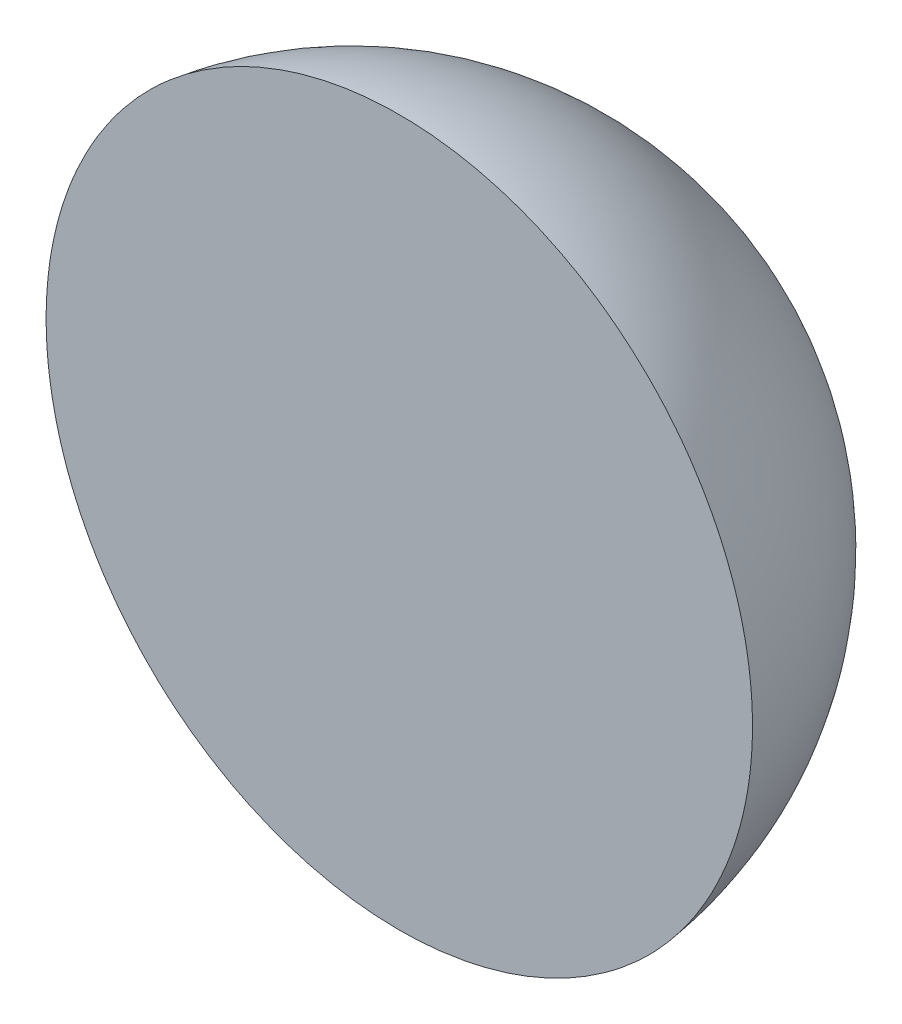
ISO-10303-21;
HEADER;
FILE_DESCRIPTION(('STEP AP214'),'2;1');
FILE_NAME('part.step','',(''),(''),'','','');
FILE_SCHEMA(('AUTOMOTIVE_DESIGN { 1 0 10303 214 1 1 1 1 }'));
ENDSEC;
DATA;
#1=APPLICATION_CONTEXT('core data for automotive mechanical design processes');
#2=APPLICATION_PROTOCOL_DEFINITION('international standard','automotive_design',2000,#1);
#3=PRODUCT_CONTEXT('',#1,'mechanical');
#4=PRODUCT('Part','Part','',(#3));
#5=PRODUCT_RELATED_PRODUCT_CATEGORY('part','',(#4));
#6=PRODUCT_DEFINITION_FORMATION('','',#4);
#7=PRODUCT_DEFINITION_CONTEXT('part definition',#1,'design');
#8=PRODUCT_DEFINITION('design','',#6,#7);
#9=PRODUCT_DEFINITION_SHAPE('','',#8);
#10=(LENGTH_UNIT() NAMED_UNIT(*) SI_UNIT(.MILLI.,.METRE.));
#11=(NAMED_UNIT(*) PLANE_ANGLE_UNIT() SI_UNIT($,.RADIAN.));
#12=(NAMED_UNIT(*) SI_UNIT($,.STERADIAN.) SOLID_ANGLE_UNIT());
#13=UNCERTAINTY_MEASURE_WITH_UNIT(LENGTH_MEASURE(1.E-05),#10,'distance_accuracy_value','');
#14=(GEOMETRIC_REPRESENTATION_CONTEXT(3) GLOBAL_UNCERTAINTY_ASSIGNED_CONTEXT((#13)) GLOBAL_UNIT_ASSIGNED_CONTEXT((#10,
#11,#12)) REPRESENTATION_CONTEXT('',''));
#15=CARTESIAN_POINT('',(0.,0.,0.));
#16=DIRECTION('',(0.,0.,1.));
#17=DIRECTION('',(1.,0.,0.));
#18=AXIS2_PLACEMENT_3D('',#15,#16,#17);
#19=CARTESIAN_POINT('',(0.,0.,-1.599999999999));
#20=DIRECTION('',(0.,0.,-1.));
#21=DIRECTION('',(0.,1.,0.));
#22=AXIS2_PLACEMENT_3D('',#19,#20,#21);
#23=PLANE('',#22);
#24=CARTESIAN_POINT('',(0.799999999999384,0.,-1.599999999999));
#25=CARTESIAN_POINT('',(0.800001322608617,-0.0271000951940282,-1.59999999999907));
#26=CARTESIAN_POINT('',(0.798622282270707,-0.0541869626766178,-1.5999999999992));
#27=CARTESIAN_POINT('',(0.79312806570739,-0.108080809149081,-1.5999999999988));
#28=CARTESIAN_POINT('',(0.78901302039351,-0.134887801468005,-1.59999999999827));
#29=CARTESIAN_POINT('',(0.774474847925798,-0.205437368554821,-1.59999999999796));
#30=CARTESIAN_POINT('',(0.761682528221304,-0.248714190276622,-1.5999999999989));
#31=CARTESIAN_POINT('',(0.729001477225804,-0.332544104636541,-1.5999999999991));
#32=CARTESIAN_POINT('',(0.709103655383789,-0.373093628718658,-1.59999999999834));
#33=CARTESIAN_POINT('',(0.662792810375328,-0.450253254033533,-1.59999999999818));
#34=CARTESIAN_POINT('',(0.636384039930345,-0.486865904364416,-1.59999999999877));
#35=CARTESIAN_POINT('',(0.577794329702892,-0.555137400507823,-1.59999999999923));
#36=CARTESIAN_POINT('',(0.545613271205197,-0.586796144411213,-1.59999999999911));
#37=CARTESIAN_POINT('',(0.476393836301417,-0.644260910404256,-1.59999999999899));
#38=CARTESIAN_POINT('',(0.439355611989522,-0.670067115687535,-1.599999999999));
#39=CARTESIAN_POINT('',(0.361470816061186,-0.715096063226908,-1.599999999999));
#40=CARTESIAN_POINT('',(0.320624084389635,-0.734318528638061,-1.599999999999));
#41=CARTESIAN_POINT('',(0.236284000522583,-0.765632598884648,-1.599999999999));
#42=CARTESIAN_POINT('',(0.192790701052133,-0.777724345727325,-1.599999999999));
#43=CARTESIAN_POINT('',(0.104391491796334,-0.794434279951736,-1.599999999999));
#44=CARTESIAN_POINT('',(0.0594855851356911,-0.799052483863867,-1.599999999999));
#45=CARTESIAN_POINT('',(-0.0304642787911564,-0.800684295663977,-1.599999999999));
#46=CARTESIAN_POINT('',(-0.0755082363410004,-0.797697887917057,-1.599999999999));
#47=CARTESIAN_POINT('',(-0.164455356905504,-0.784205229839701,-1.599999999999));
#48=CARTESIAN_POINT('',(-0.208358522087609,-0.773698993797625,-1.599999999999));
#49=CARTESIAN_POINT('',(-0.293777884585146,-0.74546493056664,-1.599999999999));
#50=CARTESIAN_POINT('',(-0.33529408096921,-0.727737100559965,-1.599999999999));
#51=CARTESIAN_POINT('',(-0.414761010366902,-0.685563065721329,-1.599999999999));
#52=CARTESIAN_POINT('',(-0.452711739388172,-0.661116853366717,-1.599999999999));
#53=CARTESIAN_POINT('',(-0.523970358269824,-0.606200028912705,-1.599999999999));
#54=CARTESIAN_POINT('',(-0.557278249730716,-0.575729418890085,-1.599999999999));
#55=CARTESIAN_POINT('',(-0.618305682376373,-0.50962877941226,-1.599999999999));
#56=CARTESIAN_POINT('',(-0.646025225965572,-0.473998752176951,-1.599999999999));
#57=CARTESIAN_POINT('',(-0.695089108452521,-0.398590694249243,-1.599999999999));
#58=CARTESIAN_POINT('',(-0.716433446423685,-0.358812662953966,-1.599999999999));
#59=CARTESIAN_POINT('',(-0.752141011774068,-0.276237776601473,-1.599999999999));
#60=CARTESIAN_POINT('',(-0.766504238178894,-0.233440921122903,-1.599999999999));
#61=CARTESIAN_POINT('',(-0.787841845676333,-0.146043270379164,-1.599999999999));
#62=CARTESIAN_POINT('',(-0.794816227099033,-0.101442475194584,-1.599999999999));
#63=CARTESIAN_POINT('',(-0.80117816339191,-0.011703030999144,-1.599999999999));
#64=CARTESIAN_POINT('',(-0.80056571864316,0.0334356179846999,-1.599999999999));
#65=CARTESIAN_POINT('',(-0.791771389068439,0.122969418381516,-1.599999999999));
#66=CARTESIAN_POINT('',(-0.783589504265493,0.167364569796749,-1.599999999999));
#67=CARTESIAN_POINT('',(-0.759888553552809,0.254151129891687,-1.599999999999));
#68=CARTESIAN_POINT('',(-0.744369487229902,0.296542538458557,-1.599999999999));
#69=CARTESIAN_POINT('',(-0.706434712983926,0.378118244926672,-1.599999999999));
#70=CARTESIAN_POINT('',(-0.684019004681219,0.417302542651376,-1.599999999999));
#71=CARTESIAN_POINT('',(-0.632927267159286,0.491351691441972,-1.599999999999));
#72=CARTESIAN_POINT('',(-0.604251238981809,0.526216543226641,-1.599999999999));
#73=CARTESIAN_POINT('',(-0.541452892940767,0.590637091808672,-1.599999999999));
#74=CARTESIAN_POINT('',(-0.507330576004324,0.620192789509809,-1.599999999999));
#75=CARTESIAN_POINT('',(-0.434608262180259,0.673156051742997,-1.599999999999));
#76=CARTESIAN_POINT('',(-0.396008263023065,0.696563613158764,-1.599999999999));
#77=CARTESIAN_POINT('',(-0.315426324086373,0.736566118673103,-1.599999999999));
#78=CARTESIAN_POINT('',(-0.273444383001483,0.753161060142064,-1.599999999999));
#79=CARTESIAN_POINT('',(-0.187290373925687,0.779067213911482,-1.599999999999));
#80=CARTESIAN_POINT('',(-0.143118308735686,0.788378435526683,-1.599999999999));
#81=CARTESIAN_POINT('',(-0.0538379303674036,0.799452865296683,-1.599999999999));
#82=CARTESIAN_POINT('',(-0.00872961750448355,0.801216075993874,-1.599999999999));
#83=CARTESIAN_POINT('',(0.081142868882372,0.797144434365928,-1.599999999999));
#84=CARTESIAN_POINT('',(0.125907041734201,0.791309567205508,-1.599999999999));
#85=CARTESIAN_POINT('',(0.213820300864332,0.7722074082978,-1.599999999999));
#86=CARTESIAN_POINT('',(0.256969391997037,0.758940138891772,-1.599999999999));
#87=CARTESIAN_POINT('',(0.340427925830399,0.725349740038376,-1.599999999999));
#88=CARTESIAN_POINT('',(0.380737357003279,0.705026581949172,-1.599999999999));
#89=CARTESIAN_POINT('',(0.45737311185212,0.657900724253376,-1.599999999999));
#90=CARTESIAN_POINT('',(0.493699332484574,0.631097857077663,-1.599999999999));
#91=CARTESIAN_POINT('',(0.561334288074458,0.571775394591993,-1.599999999999));
#92=CARTESIAN_POINT('',(0.592643302817208,0.539256118270761,-1.599999999999));
#93=CARTESIAN_POINT('',(0.649358329941155,0.469422197261483,-1.59999999999899));
#94=CARTESIAN_POINT('',(0.674764209551184,0.432107444744643,-1.59999999999898));
#95=CARTESIAN_POINT('',(0.718950710827443,0.353741600137824,-1.59999999999902));
#96=CARTESIAN_POINT('',(0.737731260880607,0.312690467667416,-1.59999999999907));
#97=CARTESIAN_POINT('',(0.768475948003741,0.227069563822732,-1.59999999999909));
#98=CARTESIAN_POINT('',(0.780277790323049,0.182441532473539,-1.59999999999905));
#99=CARTESIAN_POINT('',(0.796033625942368,0.0918618198419566,-1.59999999999895));
#100=CARTESIAN_POINT('',(0.799997759286278,0.0459119269525571,-1.59999999999888));
#101=CARTESIAN_POINT('',(0.799999999999384,0.,-1.599999999999));
#102=B_SPLINE_CURVE_WITH_KNOTS('',3,(#24,#25,#26,#27,#28,#29,#30,#31,#32,#33,#34,#35,#36,#37,
#38,#39,#40,#41,#42,#43,#44,#45,#46,#47,#48,#49,#50,#51,#52,#53,#54,#55,#56,#57,#58,#59,#60,#61,
#62,#63,#64,#65,#66,#67,#68,#69,#70,#71,#72,#73,#74,#75,#76,#77,#78,#79,#80,#81,#82,#83,#84,#85,
#86,#87,#88,#89,#90,#91,#92,#93,#94,#95,#96,#97,#98,#99,#100,#101),.UNSPECIFIED.,.T.,.F.,(4,2,2,
2,2,2,2,2,2,2,2,2,2,2,2,2,2,2,2,2,2,2,2,2,2,2,2,2,2,2,2,2,2,2,2,2,2,2,4),(0.,0.0812393179458482,
0.162474749057386,0.297175950745853,0.43205010589137,0.56683639831636,0.701625463129005,
0.83641030825028,0.971200820351604,1.10598864802844,1.24077617757366,1.37556398423904,
1.51035153479596,1.64513913794516,1.7799268920182,1.91471459962617,2.04950224924045,
2.18428991844504,2.31907760646269,2.45386528845888,2.58865296368494,2.72344063850101,
2.85822832090719,2.99301601073299,3.12780367812943,3.26259132258097,3.39737903535169,
3.53216680014921,3.66695439257392,3.80174193959822,3.93652974979623,4.07131715483405,
4.20610510701825,4.34089654527179,4.47568046424064,4.61046741442694,4.74525582147831,
4.88306672330245,5.02069921516275),.UNSPECIFIED.);
#103=CARTESIAN_POINT('',(0.799999999999384,0.,-1.599999999999));
#104=VERTEX_POINT('',#103);
#105=EDGE_CURVE('E10',#104,#104,#102,.T.);
#106=ORIENTED_EDGE('',*,*,#105,.F.);
#107=EDGE_LOOP('',(#106));
#108=FACE_BOUND('',#107,.T.);
#109=ADVANCED_FACE('F15',(#108),#23,.F.);
#110=CARTESIAN_POINT('',(0.,0.,-1.492857142858));
#111=DIRECTION('',(1.,0.,0.));
#112=DIRECTION('',(0.,1.,0.));
#113=AXIS2_PLACEMENT_3D('',#110,#111,#112);
#114=SPHERICAL_SURFACE('',#113,0.807142857142);
#115=ORIENTED_EDGE('',*,*,#105,.T.);
#116=EDGE_LOOP('',(#115));
#117=FACE_BOUND('',#116,.T.);
#118=ADVANCED_FACE('F27',(#117),#114,.T.);
#119=CLOSED_SHELL('',(#109,#118));
#120=MANIFOLD_SOLID_BREP('B1',#119);
#121=ADVANCED_BREP_SHAPE_REPRESENTATION('',(#18,#120),#14);
#122=SHAPE_DEFINITION_REPRESENTATION(#9,#121);
ENDSEC;
END-ISO-10303-21;
